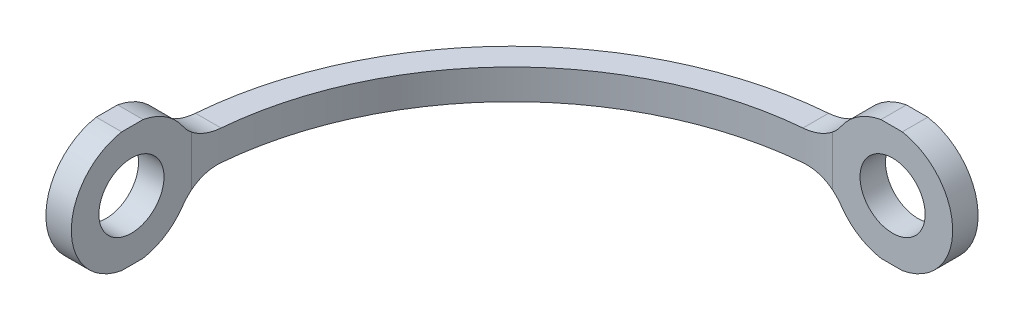
ISO-10303-21;
HEADER;
FILE_DESCRIPTION(('STEP AP214'),'2;1');
FILE_NAME('part.step','',(''),(''),'','','');
FILE_SCHEMA(('AUTOMOTIVE_DESIGN { 1 0 10303 214 1 1 1 1 }'));
ENDSEC;
DATA;
#1=APPLICATION_CONTEXT('core data for automotive mechanical design processes');
#2=APPLICATION_PROTOCOL_DEFINITION('international standard','automotive_design',2000,#1);
#3=PRODUCT_CONTEXT('',#1,'mechanical');
#4=PRODUCT('Part','Part','',(#3));
#5=PRODUCT_RELATED_PRODUCT_CATEGORY('part','',(#4));
#6=PRODUCT_DEFINITION_FORMATION('','',#4);
#7=PRODUCT_DEFINITION_CONTEXT('part definition',#1,'design');
#8=PRODUCT_DEFINITION('design','',#6,#7);
#9=PRODUCT_DEFINITION_SHAPE('','',#8);
#10=(LENGTH_UNIT() NAMED_UNIT(*) SI_UNIT(.MILLI.,.METRE.));
#11=(NAMED_UNIT(*) PLANE_ANGLE_UNIT() SI_UNIT($,.RADIAN.));
#12=(NAMED_UNIT(*) SI_UNIT($,.STERADIAN.) SOLID_ANGLE_UNIT());
#13=UNCERTAINTY_MEASURE_WITH_UNIT(LENGTH_MEASURE(1.E-05),#10,'distance_accuracy_value','');
#14=(GEOMETRIC_REPRESENTATION_CONTEXT(3) GLOBAL_UNCERTAINTY_ASSIGNED_CONTEXT((#13)) GLOBAL_UNIT_ASSIGNED_CONTEXT((#10,
#11,#12)) REPRESENTATION_CONTEXT('',''));
#15=CARTESIAN_POINT('',(0.,0.,0.));
#16=DIRECTION('',(0.,0.,1.));
#17=DIRECTION('',(1.,0.,0.));
#18=AXIS2_PLACEMENT_3D('',#15,#16,#17);
#19=CARTESIAN_POINT('',(-23.75,3.75,0.));
#20=DIRECTION('',(1.,0.,0.));
#21=DIRECTION('',(0.,0.,-1.));
#22=AXIS2_PLACEMENT_3D('',#19,#20,#21);
#23=PLANE('',#22);
#24=CARTESIAN_POINT('',(-23.75,0.,0.));
#25=DIRECTION('',(1.,0.,0.));
#26=DIRECTION('',(0.,0.,-1.));
#27=AXIS2_PLACEMENT_3D('',#24,#25,#26);
#28=CIRCLE('',#27,2.032);
#29=CARTESIAN_POINT('',(-23.75,0.,-2.032));
#30=VERTEX_POINT('',#29);
#31=EDGE_CURVE('E515',#30,#30,#28,.T.);
#32=ORIENTED_EDGE('',*,*,#31,.F.);
#33=EDGE_LOOP('',(#32));
#34=FACE_BOUND('',#33,.T.);
#35=DIRECTION('',(0.,0.,1.));
#36=VECTOR('',#35,1.);
#37=CARTESIAN_POINT('',(-23.75,3.75,0.));
#38=LINE('',#37,#36);
#39=CARTESIAN_POINT('',(-23.75,3.75,-0.724090821773479));
#40=VERTEX_POINT('',#39);
#41=CARTESIAN_POINT('',(-23.75,3.75,0.60690332177348));
#42=VERTEX_POINT('',#41);
#43=EDGE_CURVE('E320',#40,#42,#38,.T.);
#44=ORIENTED_EDGE('',*,*,#43,.T.);
#45=CARTESIAN_POINT('',(-23.75,0.,-0.0585937499999996));
#46=DIRECTION('',(1.,0.,0.));
#47=DIRECTION('',(0.,0.,-1.));
#48=AXIS2_PLACEMENT_3D('',#45,#46,#47);
#49=CIRCLE('',#48,3.80859375);
#50=CARTESIAN_POINT('',(-23.75,-3.75,0.60690332177348));
#51=VERTEX_POINT('',#50);
#52=EDGE_CURVE('E304',#42,#51,#49,.T.);
#53=ORIENTED_EDGE('',*,*,#52,.T.);
#54=DIRECTION('',(0.,0.,1.));
#55=VECTOR('',#54,1.);
#56=CARTESIAN_POINT('',(-23.75,-3.75,0.));
#57=LINE('',#56,#55);
#58=CARTESIAN_POINT('',(-23.75,-3.75,-0.724090821773479));
#59=VERTEX_POINT('',#58);
#60=EDGE_CURVE('E328',#59,#51,#57,.T.);
#61=ORIENTED_EDGE('',*,*,#60,.F.);
#62=CARTESIAN_POINT('',(-23.75,0.,-0.0585937499999996));
#63=DIRECTION('',(1.,0.,0.));
#64=DIRECTION('',(0.,0.,-1.));
#65=AXIS2_PLACEMENT_3D('',#62,#63,#64);
#66=CIRCLE('',#65,3.80859375);
#67=CARTESIAN_POINT('',(-23.75,-2.1570796460177,-3.1974460487352));
#68=VERTEX_POINT('',#67);
#69=EDGE_CURVE('E313',#59,#68,#66,.T.);
#70=ORIENTED_EDGE('',*,*,#69,.T.);
#71=CARTESIAN_POINT('',(-23.75,-3.75,-5.51536774626273));
#72=DIRECTION('',(1.,0.,0.));
#73=DIRECTION('',(0.,0.,-1.));
#74=AXIS2_PLACEMENT_3D('',#71,#72,#73);
#75=CIRCLE('',#74,2.8125);
#76=CARTESIAN_POINT('',(-23.75,-1.56056332120433,-3.75));
#77=VERTEX_POINT('',#76);
#78=EDGE_CURVE('E421',#68,#77,#75,.F.);
#79=ORIENTED_EDGE('',*,*,#78,.T.);
#80=DIRECTION('',(0.,-1.,0.));
#81=VECTOR('',#80,1.);
#82=CARTESIAN_POINT('',(-23.75,0.9375,-3.75));
#83=LINE('',#82,#81);
#84=CARTESIAN_POINT('',(-23.75,1.56056332120433,-3.75));
#85=VERTEX_POINT('',#84);
#86=EDGE_CURVE('E178',#85,#77,#83,.T.);
#87=ORIENTED_EDGE('',*,*,#86,.F.);
#88=CARTESIAN_POINT('',(-23.75,3.75,-5.51536774626273));
#89=DIRECTION('',(1.,0.,0.));
#90=DIRECTION('',(0.,0.,-1.));
#91=AXIS2_PLACEMENT_3D('',#88,#89,#90);
#92=CIRCLE('',#91,2.8125);
#93=CARTESIAN_POINT('',(-23.75,2.1570796460177,-3.1974460487352));
#94=VERTEX_POINT('',#93);
#95=EDGE_CURVE('E463',#85,#94,#92,.F.);
#96=ORIENTED_EDGE('',*,*,#95,.T.);
#97=CARTESIAN_POINT('',(-23.75,0.,-0.0585937499999996));
#98=DIRECTION('',(1.,0.,0.));
#99=DIRECTION('',(0.,0.,-1.));
#100=AXIS2_PLACEMENT_3D('',#97,#98,#99);
#101=CIRCLE('',#100,3.80859375);
#102=EDGE_CURVE('E525',#94,#40,#101,.T.);
#103=ORIENTED_EDGE('',*,*,#102,.T.);
#104=EDGE_LOOP('',(#44,#53,#61,#70,#79,#87,#96,#103));
#105=FACE_BOUND('',#104,.T.);
#106=ADVANCED_FACE('F150',(#34,#105),#23,.T.);
#107=CARTESIAN_POINT('',(-25.3375,3.75,0.));
#108=DIRECTION('',(1.,0.,0.));
#109=DIRECTION('',(0.,0.,-1.));
#110=AXIS2_PLACEMENT_3D('',#107,#108,#109);
#111=PLANE('',#110);
#112=CARTESIAN_POINT('',(-25.3375,0.,0.));
#113=DIRECTION('',(1.,0.,0.));
#114=DIRECTION('',(0.,0.,-1.));
#115=AXIS2_PLACEMENT_3D('',#112,#113,#114);
#116=CIRCLE('',#115,2.032);
#117=CARTESIAN_POINT('',(-25.3375,0.,-2.032));
#118=VERTEX_POINT('',#117);
#119=EDGE_CURVE('E511',#118,#118,#116,.T.);
#120=ORIENTED_EDGE('',*,*,#119,.T.);
#121=EDGE_LOOP('',(#120));
#122=FACE_BOUND('',#121,.T.);
#123=CARTESIAN_POINT('',(-25.3375,0.,-0.0585937499999996));
#124=DIRECTION('',(1.,0.,0.));
#125=DIRECTION('',(0.,0.,-1.));
#126=AXIS2_PLACEMENT_3D('',#123,#124,#125);
#127=CIRCLE('',#126,3.80859375);
#128=CARTESIAN_POINT('',(-25.3375,3.75,0.60690332177348));
#129=VERTEX_POINT('',#128);
#130=CARTESIAN_POINT('',(-25.3375,-3.75,0.60690332177348));
#131=VERTEX_POINT('',#130);
#132=EDGE_CURVE('E292',#129,#131,#127,.T.);
#133=ORIENTED_EDGE('',*,*,#132,.F.);
#134=DIRECTION('',(0.,0.,1.));
#135=VECTOR('',#134,1.);
#136=CARTESIAN_POINT('',(-25.3375,3.75,0.));
#137=LINE('',#136,#135);
#138=CARTESIAN_POINT('',(-25.3375,3.75,-0.724090821773479));
#139=VERTEX_POINT('',#138);
#140=EDGE_CURVE('E297',#139,#129,#137,.T.);
#141=ORIENTED_EDGE('',*,*,#140,.F.);
#142=CARTESIAN_POINT('',(-25.3375,0.,-0.0585937499999996));
#143=DIRECTION('',(1.,0.,0.));
#144=DIRECTION('',(0.,0.,-1.));
#145=AXIS2_PLACEMENT_3D('',#142,#143,#144);
#146=CIRCLE('',#145,3.80859375);
#147=CARTESIAN_POINT('',(-25.3375,2.1570796460177,-3.1974460487352));
#148=VERTEX_POINT('',#147);
#149=EDGE_CURVE('E460',#148,#139,#146,.T.);
#150=ORIENTED_EDGE('',*,*,#149,.F.);
#151=CARTESIAN_POINT('',(-25.3375,3.75,-5.51536774626273));
#152=DIRECTION('',(1.,0.,0.));
#153=DIRECTION('',(0.,0.,-1.));
#154=AXIS2_PLACEMENT_3D('',#151,#152,#153);
#155=CIRCLE('',#154,2.8125);
#156=CARTESIAN_POINT('',(-25.3375,1.56056332120433,-3.75));
#157=VERTEX_POINT('',#156);
#158=EDGE_CURVE('E164',#148,#157,#155,.T.);
#159=ORIENTED_EDGE('',*,*,#158,.T.);
#160=DIRECTION('',(0.,-1.,0.));
#161=VECTOR('',#160,1.);
#162=CARTESIAN_POINT('',(-25.3375,0.9375,-3.75));
#163=LINE('',#162,#161);
#164=CARTESIAN_POINT('',(-25.3375,-1.56056332120433,-3.75));
#165=VERTEX_POINT('',#164);
#166=EDGE_CURVE('E170',#157,#165,#163,.T.);
#167=ORIENTED_EDGE('',*,*,#166,.T.);
#168=CARTESIAN_POINT('',(-25.3375,-3.75,-5.51536774626273));
#169=DIRECTION('',(1.,0.,0.));
#170=DIRECTION('',(0.,0.,-1.));
#171=AXIS2_PLACEMENT_3D('',#168,#169,#170);
#172=CIRCLE('',#171,2.8125);
#173=CARTESIAN_POINT('',(-25.3375,-2.1570796460177,-3.1974460487352));
#174=VERTEX_POINT('',#173);
#175=EDGE_CURVE('E396',#165,#174,#172,.T.);
#176=ORIENTED_EDGE('',*,*,#175,.T.);
#177=CARTESIAN_POINT('',(-25.3375,0.,-0.0585937499999996));
#178=DIRECTION('',(1.,0.,0.));
#179=DIRECTION('',(0.,0.,-1.));
#180=AXIS2_PLACEMENT_3D('',#177,#178,#179);
#181=CIRCLE('',#180,3.80859375);
#182=CARTESIAN_POINT('',(-25.3375,-3.75,-0.724090821773479));
#183=VERTEX_POINT('',#182);
#184=EDGE_CURVE('E526',#183,#174,#181,.T.);
#185=ORIENTED_EDGE('',*,*,#184,.F.);
#186=DIRECTION('',(0.,0.,1.));
#187=VECTOR('',#186,1.);
#188=CARTESIAN_POINT('',(-25.3375,-3.75,0.));
#189=LINE('',#188,#187);
#190=EDGE_CURVE('E300',#183,#131,#189,.T.);
#191=ORIENTED_EDGE('',*,*,#190,.T.);
#192=EDGE_LOOP('',(#133,#141,#150,#159,#167,#176,#185,#191));
#193=FACE_BOUND('',#192,.T.);
#194=ADVANCED_FACE('F294',(#122,#193),#111,.F.);
#195=CARTESIAN_POINT('',(0.,3.75,0.));
#196=DIRECTION('',(0.,1.,0.));
#197=DIRECTION('',(0.,0.,1.));
#198=AXIS2_PLACEMENT_3D('',#195,#196,#197);
#199=PLANE('',#198);
#200=ORIENTED_EDGE('',*,*,#140,.T.);
#201=DIRECTION('',(1.,0.,0.));
#202=VECTOR('',#201,1.);
#203=CARTESIAN_POINT('',(-25.3375,3.75,0.60690332177348));
#204=LINE('',#203,#202);
#205=EDGE_CURVE('E307',#129,#42,#204,.T.);
#206=ORIENTED_EDGE('',*,*,#205,.T.);
#207=ORIENTED_EDGE('',*,*,#43,.F.);
#208=DIRECTION('',(1.,0.,0.));
#209=VECTOR('',#208,1.);
#210=CARTESIAN_POINT('',(-25.3375,3.75,-0.724090821773479));
#211=LINE('',#210,#209);
#212=EDGE_CURVE('E318',#139,#40,#211,.T.);
#213=ORIENTED_EDGE('',*,*,#212,.F.);
#214=EDGE_LOOP('',(#200,#206,#207,#213));
#215=FACE_BOUND('',#214,.T.);
#216=ADVANCED_FACE('F316',(#215),#199,.T.);
#217=CARTESIAN_POINT('',(0.,-3.75,0.));
#218=DIRECTION('',(0.,1.,0.));
#219=DIRECTION('',(0.,0.,1.));
#220=AXIS2_PLACEMENT_3D('',#217,#218,#219);
#221=PLANE('',#220);
#222=DIRECTION('',(1.,0.,0.));
#223=VECTOR('',#222,1.);
#224=CARTESIAN_POINT('',(-25.3375,-3.75,-0.724090821773479));
#225=LINE('',#224,#223);
#226=EDGE_CURVE('E522',#183,#59,#225,.T.);
#227=ORIENTED_EDGE('',*,*,#226,.T.);
#228=ORIENTED_EDGE('',*,*,#60,.T.);
#229=DIRECTION('',(1.,0.,0.));
#230=VECTOR('',#229,1.);
#231=CARTESIAN_POINT('',(-25.3375,-3.75,0.60690332177348));
#232=LINE('',#231,#230);
#233=EDGE_CURVE('E303',#131,#51,#232,.T.);
#234=ORIENTED_EDGE('',*,*,#233,.F.);
#235=ORIENTED_EDGE('',*,*,#190,.F.);
#236=EDGE_LOOP('',(#227,#228,#234,#235));
#237=FACE_BOUND('',#236,.T.);
#238=ADVANCED_FACE('F591',(#237),#221,.F.);
#239=CARTESIAN_POINT('',(0.,3.75,-23.75));
#240=DIRECTION('',(0.,0.,-1.));
#241=DIRECTION('',(-1.,0.,0.));
#242=AXIS2_PLACEMENT_3D('',#239,#240,#241);
#243=PLANE('',#242);
#244=CARTESIAN_POINT('',(0.,0.,-23.75));
#245=DIRECTION('',(0.,0.,1.));
#246=DIRECTION('',(1.,0.,0.));
#247=AXIS2_PLACEMENT_3D('',#244,#245,#246);
#248=CIRCLE('',#247,2.032);
#249=CARTESIAN_POINT('',(2.032,0.,-23.75));
#250=VERTEX_POINT('',#249);
#251=EDGE_CURVE('E483',#250,#250,#248,.T.);
#252=ORIENTED_EDGE('',*,*,#251,.F.);
#253=EDGE_LOOP('',(#252));
#254=FACE_BOUND('',#253,.T.);
#255=DIRECTION('',(1.,0.,0.));
#256=VECTOR('',#255,1.);
#257=CARTESIAN_POINT('',(0.,-3.75,-23.75));
#258=LINE('',#257,#256);
#259=CARTESIAN_POINT('',(-0.724090821773469,-3.75,-23.75));
#260=VERTEX_POINT('',#259);
#261=CARTESIAN_POINT('',(0.606903321773469,-3.75,-23.75));
#262=VERTEX_POINT('',#261);
#263=EDGE_CURVE('E477',#260,#262,#258,.T.);
#264=ORIENTED_EDGE('',*,*,#263,.T.);
#265=CARTESIAN_POINT('',(-0.0585937500000001,0.,-23.75));
#266=DIRECTION('',(0.,0.,1.));
#267=DIRECTION('',(1.,0.,0.));
#268=AXIS2_PLACEMENT_3D('',#265,#266,#267);
#269=CIRCLE('',#268,3.80859375);
#270=CARTESIAN_POINT('',(0.606903321773469,3.75,-23.75));
#271=VERTEX_POINT('',#270);
#272=EDGE_CURVE('E493',#262,#271,#269,.T.);
#273=ORIENTED_EDGE('',*,*,#272,.T.);
#274=DIRECTION('',(1.,0.,0.));
#275=VECTOR('',#274,1.);
#276=CARTESIAN_POINT('',(0.,3.75,-23.75));
#277=LINE('',#276,#275);
#278=CARTESIAN_POINT('',(-0.724090821773469,3.75,-23.75));
#279=VERTEX_POINT('',#278);
#280=EDGE_CURVE('E447',#279,#271,#277,.T.);
#281=ORIENTED_EDGE('',*,*,#280,.F.);
#282=CARTESIAN_POINT('',(-0.0585937500000001,0.,-23.75));
#283=DIRECTION('',(0.,0.,1.));
#284=DIRECTION('',(1.,0.,0.));
#285=AXIS2_PLACEMENT_3D('',#282,#283,#284);
#286=CIRCLE('',#285,3.80859375);
#287=CARTESIAN_POINT('',(-3.1974460487352,2.1570796460177,-23.75));
#288=VERTEX_POINT('',#287);
#289=EDGE_CURVE('E491',#279,#288,#286,.T.);
#290=ORIENTED_EDGE('',*,*,#289,.T.);
#291=CARTESIAN_POINT('',(-5.51536774626272,3.75,-23.75));
#292=DIRECTION('',(0.,0.,-1.));
#293=DIRECTION('',(-1.,0.,0.));
#294=AXIS2_PLACEMENT_3D('',#291,#292,#293);
#295=CIRCLE('',#294,2.8125);
#296=CARTESIAN_POINT('',(-3.75,1.56056332120433,-23.75));
#297=VERTEX_POINT('',#296);
#298=EDGE_CURVE('E422',#288,#297,#295,.T.);
#299=ORIENTED_EDGE('',*,*,#298,.T.);
#300=DIRECTION('',(0.,-1.,0.));
#301=VECTOR('',#300,1.);
#302=CARTESIAN_POINT('',(-3.75,0.9375,-23.75));
#303=LINE('',#302,#301);
#304=CARTESIAN_POINT('',(-3.75,-1.56056332120433,-23.75));
#305=VERTEX_POINT('',#304);
#306=EDGE_CURVE('E455',#297,#305,#303,.T.);
#307=ORIENTED_EDGE('',*,*,#306,.T.);
#308=CARTESIAN_POINT('',(-5.51536774626272,-3.75,-23.75));
#309=DIRECTION('',(0.,0.,-1.));
#310=DIRECTION('',(-1.,0.,0.));
#311=AXIS2_PLACEMENT_3D('',#308,#309,#310);
#312=CIRCLE('',#311,2.8125);
#313=CARTESIAN_POINT('',(-3.1974460487352,-2.1570796460177,-23.75));
#314=VERTEX_POINT('',#313);
#315=EDGE_CURVE('E546',#305,#314,#312,.T.);
#316=ORIENTED_EDGE('',*,*,#315,.T.);
#317=CARTESIAN_POINT('',(-0.0585937500000001,0.,-23.75));
#318=DIRECTION('',(0.,0.,1.));
#319=DIRECTION('',(1.,0.,0.));
#320=AXIS2_PLACEMENT_3D('',#317,#318,#319);
#321=CIRCLE('',#320,3.80859375);
#322=EDGE_CURVE('E509',#314,#260,#321,.T.);
#323=ORIENTED_EDGE('',*,*,#322,.T.);
#324=EDGE_LOOP('',(#264,#273,#281,#290,#299,#307,#316,#323));
#325=FACE_BOUND('',#324,.T.);
#326=ADVANCED_FACE('F564',(#254,#325),#243,.F.);
#327=CARTESIAN_POINT('',(0.,3.75,-25.3375));
#328=DIRECTION('',(0.,0.,-1.));
#329=DIRECTION('',(-1.,0.,0.));
#330=AXIS2_PLACEMENT_3D('',#327,#328,#329);
#331=PLANE('',#330);
#332=CARTESIAN_POINT('',(0.,0.,-25.3375));
#333=DIRECTION('',(0.,0.,1.));
#334=DIRECTION('',(1.,0.,0.));
#335=AXIS2_PLACEMENT_3D('',#332,#333,#334);
#336=CIRCLE('',#335,2.032);
#337=CARTESIAN_POINT('',(2.032,0.,-25.3375));
#338=VERTEX_POINT('',#337);
#339=EDGE_CURVE('E479',#338,#338,#336,.T.);
#340=ORIENTED_EDGE('',*,*,#339,.T.);
#341=EDGE_LOOP('',(#340));
#342=FACE_BOUND('',#341,.T.);
#343=CARTESIAN_POINT('',(-0.0585937500000001,0.,-25.3375));
#344=DIRECTION('',(0.,0.,1.));
#345=DIRECTION('',(1.,0.,0.));
#346=AXIS2_PLACEMENT_3D('',#343,#344,#345);
#347=CIRCLE('',#346,3.80859375);
#348=CARTESIAN_POINT('',(0.606903321773469,-3.75,-25.3375));
#349=VERTEX_POINT('',#348);
#350=CARTESIAN_POINT('',(0.606903321773469,3.75,-25.3375));
#351=VERTEX_POINT('',#350);
#352=EDGE_CURVE('E492',#349,#351,#347,.T.);
#353=ORIENTED_EDGE('',*,*,#352,.F.);
#354=DIRECTION('',(1.,0.,0.));
#355=VECTOR('',#354,1.);
#356=CARTESIAN_POINT('',(0.,-3.75,-25.3375));
#357=LINE('',#356,#355);
#358=CARTESIAN_POINT('',(-0.724090821773469,-3.75,-25.3375));
#359=VERTEX_POINT('',#358);
#360=EDGE_CURVE('E474',#359,#349,#357,.T.);
#361=ORIENTED_EDGE('',*,*,#360,.F.);
#362=CARTESIAN_POINT('',(-0.0585937500000001,0.,-25.3375));
#363=DIRECTION('',(0.,0.,1.));
#364=DIRECTION('',(1.,0.,0.));
#365=AXIS2_PLACEMENT_3D('',#362,#363,#364);
#366=CIRCLE('',#365,3.80859375);
#367=CARTESIAN_POINT('',(-3.1974460487352,-2.1570796460177,-25.3375));
#368=VERTEX_POINT('',#367);
#369=EDGE_CURVE('E508',#368,#359,#366,.T.);
#370=ORIENTED_EDGE('',*,*,#369,.F.);
#371=CARTESIAN_POINT('',(-5.51536774626272,-3.75,-25.3375));
#372=DIRECTION('',(0.,0.,-1.));
#373=DIRECTION('',(-1.,0.,0.));
#374=AXIS2_PLACEMENT_3D('',#371,#372,#373);
#375=CIRCLE('',#374,2.8125);
#376=CARTESIAN_POINT('',(-3.75,-1.56056332120433,-25.3375));
#377=VERTEX_POINT('',#376);
#378=EDGE_CURVE('E348',#368,#377,#375,.F.);
#379=ORIENTED_EDGE('',*,*,#378,.T.);
#380=DIRECTION('',(0.,-1.,0.));
#381=VECTOR('',#380,1.);
#382=CARTESIAN_POINT('',(-3.75,0.9375,-25.3375));
#383=LINE('',#382,#381);
#384=CARTESIAN_POINT('',(-3.75,1.56056332120433,-25.3375));
#385=VERTEX_POINT('',#384);
#386=EDGE_CURVE('E453',#385,#377,#383,.T.);
#387=ORIENTED_EDGE('',*,*,#386,.F.);
#388=CARTESIAN_POINT('',(-5.51536774626272,3.75,-25.3375));
#389=DIRECTION('',(0.,0.,-1.));
#390=DIRECTION('',(-1.,0.,0.));
#391=AXIS2_PLACEMENT_3D('',#388,#389,#390);
#392=CIRCLE('',#391,2.8125);
#393=CARTESIAN_POINT('',(-3.1974460487352,2.1570796460177,-25.3375));
#394=VERTEX_POINT('',#393);
#395=EDGE_CURVE('E545',#385,#394,#392,.F.);
#396=ORIENTED_EDGE('',*,*,#395,.T.);
#397=CARTESIAN_POINT('',(-0.0585937500000001,0.,-25.3375));
#398=DIRECTION('',(0.,0.,1.));
#399=DIRECTION('',(1.,0.,0.));
#400=AXIS2_PLACEMENT_3D('',#397,#398,#399);
#401=CIRCLE('',#400,3.80859375);
#402=CARTESIAN_POINT('',(-0.724090821773469,3.75,-25.3375));
#403=VERTEX_POINT('',#402);
#404=EDGE_CURVE('E500',#403,#394,#401,.T.);
#405=ORIENTED_EDGE('',*,*,#404,.F.);
#406=DIRECTION('',(1.,0.,0.));
#407=VECTOR('',#406,1.);
#408=CARTESIAN_POINT('',(0.,3.75,-25.3375));
#409=LINE('',#408,#407);
#410=EDGE_CURVE('E444',#403,#351,#409,.T.);
#411=ORIENTED_EDGE('',*,*,#410,.T.);
#412=EDGE_LOOP('',(#353,#361,#370,#379,#387,#396,#405,#411));
#413=FACE_BOUND('',#412,.T.);
#414=ADVANCED_FACE('F559',(#342,#413),#331,.T.);
#415=CARTESIAN_POINT('',(0.,-3.75,0.));
#416=DIRECTION('',(0.,1.,0.));
#417=DIRECTION('',(0.,0.,1.));
#418=AXIS2_PLACEMENT_3D('',#415,#416,#417);
#419=PLANE('',#418);
#420=DIRECTION('',(0.,0.,1.));
#421=VECTOR('',#420,1.);
#422=CARTESIAN_POINT('',(0.606903321773469,-3.75,-25.3375));
#423=LINE('',#422,#421);
#424=EDGE_CURVE('E496',#349,#262,#423,.T.);
#425=ORIENTED_EDGE('',*,*,#424,.T.);
#426=ORIENTED_EDGE('',*,*,#263,.F.);
#427=DIRECTION('',(0.,0.,1.));
#428=VECTOR('',#427,1.);
#429=CARTESIAN_POINT('',(-0.724090821773469,-3.75,-25.3375));
#430=LINE('',#429,#428);
#431=EDGE_CURVE('E505',#359,#260,#430,.T.);
#432=ORIENTED_EDGE('',*,*,#431,.F.);
#433=ORIENTED_EDGE('',*,*,#360,.T.);
#434=EDGE_LOOP('',(#425,#426,#432,#433));
#435=FACE_BOUND('',#434,.T.);
#436=ADVANCED_FACE('F562',(#435),#419,.F.);
#437=CARTESIAN_POINT('',(0.,3.75,0.));
#438=DIRECTION('',(0.,1.,0.));
#439=DIRECTION('',(0.,0.,1.));
#440=AXIS2_PLACEMENT_3D('',#437,#438,#439);
#441=PLANE('',#440);
#442=ORIENTED_EDGE('',*,*,#280,.T.);
#443=DIRECTION('',(0.,0.,1.));
#444=VECTOR('',#443,1.);
#445=CARTESIAN_POINT('',(0.606903321773469,3.75,-25.3375));
#446=LINE('',#445,#444);
#447=EDGE_CURVE('E489',#351,#271,#446,.T.);
#448=ORIENTED_EDGE('',*,*,#447,.F.);
#449=ORIENTED_EDGE('',*,*,#410,.F.);
#450=DIRECTION('',(0.,0.,1.));
#451=VECTOR('',#450,1.);
#452=CARTESIAN_POINT('',(-0.724090821773469,3.75,-25.3375));
#453=LINE('',#452,#451);
#454=EDGE_CURVE('E486',#403,#279,#453,.T.);
#455=ORIENTED_EDGE('',*,*,#454,.T.);
#456=EDGE_LOOP('',(#442,#448,#449,#455));
#457=FACE_BOUND('',#456,.T.);
#458=ADVANCED_FACE('F374',(#457),#441,.T.);
#459=CARTESIAN_POINT('',(-3.75,0.9375,-3.75));
#460=DIRECTION('',(0.,-1.,0.));
#461=DIRECTION('',(0.,0.,-1.));
#462=AXIS2_PLACEMENT_3D('',#459,#460,#461);
#463=CYLINDRICAL_SURFACE('',#462,21.5875);
#464=CARTESIAN_POINT('',(-3.75,-0.9375,-3.75));
#465=DIRECTION('',(0.,1.,0.));
#466=DIRECTION('',(0.,0.,1.));
#467=AXIS2_PLACEMENT_3D('',#464,#465,#466);
#468=CIRCLE('',#467,21.5875);
#469=CARTESIAN_POINT('',(-25.2651953969852,-0.9375,-5.51536774626273));
#470=VERTEX_POINT('',#469);
#471=CARTESIAN_POINT('',(-5.51536774626272,-0.9375,-25.2651953969852));
#472=VERTEX_POINT('',#471);
#473=EDGE_CURVE('E438',#470,#472,#468,.F.);
#474=ORIENTED_EDGE('',*,*,#473,.F.);
#475=CARTESIAN_POINT('',(-25.2651953969852,-0.9375,-5.51536774626273));
#476=CARTESIAN_POINT('',(-25.2717217558268,-0.937503472351098,-5.43585416186746));
#477=CARTESIAN_POINT('',(-25.2777984224328,-0.940875194685704,-5.35635321840536));
#478=CARTESIAN_POINT('',(-25.2890377681447,-0.954345081140914,-5.19786444495695));
#479=CARTESIAN_POINT('',(-25.2942005138159,-0.964442755121366,-5.11887657800472));
#480=CARTESIAN_POINT('',(-25.3080265186864,-1.00403495322714,-4.88792003439603));
#481=CARTESIAN_POINT('',(-25.3154036960389,-1.04284113593898,-4.73732281709651));
#482=CARTESIAN_POINT('',(-25.3240338308249,-1.1197968784784,-4.51610592071666));
#483=CARTESIAN_POINT('',(-25.3265192397188,-1.14904841664185,-4.44227963912289));
#484=CARTESIAN_POINT('',(-25.3306822000775,-1.21370645371072,-4.29731258505503));
#485=CARTESIAN_POINT('',(-25.3323596911958,-1.24911341211965,-4.22617201355272));
#486=CARTESIAN_POINT('',(-25.3350178619855,-1.32695633930889,-4.08508900310209));
#487=CARTESIAN_POINT('',(-25.3359765536418,-1.36956867861164,-4.01524363101035));
#488=CARTESIAN_POINT('',(-25.3372187116092,-1.4607114359778,-3.87951654386469));
#489=CARTESIAN_POINT('',(-25.3375021483239,-1.50924211334292,-3.81363500266812));
#490=CARTESIAN_POINT('',(-25.3375,-1.56056332120443,-3.75000000000003));
#491=B_SPLINE_CURVE_WITH_KNOTS('',3,(#475,#476,#477,#478,#479,#480,#481,#482,#483,#484,#485,
#486,#487,#488,#489,#490),.UNSPECIFIED.,.F.,.F.,(4,2,2,2,2,2,2,4),(0.,0.239171445250047,
0.4783254632703,0.942852073484854,1.18097702418579,1.4191197586068,1.66427939594,
1.90944977837878),.UNSPECIFIED.);
#492=EDGE_CURVE('E389',#470,#165,#491,.T.);
#493=ORIENTED_EDGE('',*,*,#492,.T.);
#494=ORIENTED_EDGE('',*,*,#166,.F.);
#495=CARTESIAN_POINT('',(-25.3375,1.56056332120433,-3.75));
#496=CARTESIAN_POINT('',(-25.3375000530267,1.51048959596684,-3.81210795158343));
#497=CARTESIAN_POINT('',(-25.3372313814973,1.46308661231712,-3.87630527268948));
#498=CARTESIAN_POINT('',(-25.3360539180094,1.37390615367223,-4.00848226516097));
#499=CARTESIAN_POINT('',(-25.3351451732863,1.33212826383519,-4.07646165708151));
#500=CARTESIAN_POINT('',(-25.3313785680316,1.21788520040795,-4.28147735094193));
#501=CARTESIAN_POINT('',(-25.3274909397047,1.15360267159282,-4.42322083282858));
#502=CARTESIAN_POINT('',(-25.3191204038627,1.07477345991571,-4.64378508658154));
#503=CARTESIAN_POINT('',(-25.3158509879836,1.05125585060983,-4.71960520082195));
#504=CARTESIAN_POINT('',(-25.3084093948218,1.01070541197751,-4.87295099530739));
#505=CARTESIAN_POINT('',(-25.304237150186,0.993673066728496,-4.95047680241322));
#506=CARTESIAN_POINT('',(-25.2948353759149,0.965825475443744,-5.1089327384317));
#507=CARTESIAN_POINT('',(-25.2895783173621,0.955208188358318,-5.18989587128707));
#508=CARTESIAN_POINT('',(-25.2781035160207,0.941040708703425,-5.35237408770167));
#509=CARTESIAN_POINT('',(-25.2718857315648,0.93749082274439,-5.43388919505369));
#510=CARTESIAN_POINT('',(-25.2651953969852,0.9375,-5.51536774626273));
#511=B_SPLINE_CURVE_WITH_KNOTS('',3,(#495,#496,#497,#498,#499,#500,#501,#502,#503,#504,#505,
#506,#507,#508,#509,#510),.UNSPECIFIED.,.F.,.F.,(4,2,2,2,2,2,2,4),(0.,0.239166297928719,
0.478314948045533,0.942830592711207,1.18096118673584,1.41910955198117,1.66427445995376,
1.9094500038701),.UNSPECIFIED.);
#512=CARTESIAN_POINT('',(-25.2651953969852,0.9375,-5.51536774626273));
#513=VERTEX_POINT('',#512);
#514=EDGE_CURVE('E12',#157,#513,#511,.T.);
#515=ORIENTED_EDGE('',*,*,#514,.T.);
#516=CARTESIAN_POINT('',(-3.75,0.9375,-3.75));
#517=DIRECTION('',(0.,1.,0.));
#518=DIRECTION('',(0.,0.,1.));
#519=AXIS2_PLACEMENT_3D('',#516,#517,#518);
#520=CIRCLE('',#519,21.5875);
#521=CARTESIAN_POINT('',(-5.51536774626272,0.9375,-25.2651953969852));
#522=VERTEX_POINT('',#521);
#523=EDGE_CURVE('E437',#513,#522,#520,.F.);
#524=ORIENTED_EDGE('',*,*,#523,.T.);
#525=CARTESIAN_POINT('',(-5.51536774626272,0.9375,-25.2651953969852));
#526=CARTESIAN_POINT('',(-5.43585416186746,0.937503472351098,-25.2717217558268));
#527=CARTESIAN_POINT('',(-5.35635321840535,0.940875194685704,-25.2777984224328));
#528=CARTESIAN_POINT('',(-5.19786444495695,0.954345081140914,-25.2890377681447));
#529=CARTESIAN_POINT('',(-5.11887657800472,0.964442755121366,-25.2942005138159));
#530=CARTESIAN_POINT('',(-4.88792003439603,1.00403495322714,-25.3080265186864));
#531=CARTESIAN_POINT('',(-4.73732281709651,1.04284113593898,-25.3154036960389));
#532=CARTESIAN_POINT('',(-4.51610592071666,1.1197968784784,-25.3240338308249));
#533=CARTESIAN_POINT('',(-4.44227963912289,1.14904841664185,-25.3265192397188));
#534=CARTESIAN_POINT('',(-4.29731258505503,1.21370645371072,-25.3306822000775));
#535=CARTESIAN_POINT('',(-4.22617201355272,1.24911341211964,-25.3323596911958));
#536=CARTESIAN_POINT('',(-4.08508900310209,1.32695633930889,-25.3350178619855));
#537=CARTESIAN_POINT('',(-4.01524363101035,1.36956867861164,-25.3359765536418));
#538=CARTESIAN_POINT('',(-3.87951654386469,1.4607114359778,-25.3372187116092));
#539=CARTESIAN_POINT('',(-3.81363500266812,1.50924211334292,-25.3375021483239));
#540=CARTESIAN_POINT('',(-3.75000000000003,1.56056332120443,-25.3375));
#541=B_SPLINE_CURVE_WITH_KNOTS('',3,(#525,#526,#527,#528,#529,#530,#531,#532,#533,#534,#535,
#536,#537,#538,#539,#540),.UNSPECIFIED.,.F.,.F.,(4,2,2,2,2,2,2,4),(0.,0.239171445250047,
0.4783254632703,0.942852073484854,1.18097702418578,1.4191197586068,1.66427939593999,
1.90944977837878),.UNSPECIFIED.);
#542=EDGE_CURVE('E382',#522,#385,#541,.T.);
#543=ORIENTED_EDGE('',*,*,#542,.T.);
#544=ORIENTED_EDGE('',*,*,#386,.T.);
#545=CARTESIAN_POINT('',(-3.75,-1.56056332120433,-25.3375));
#546=CARTESIAN_POINT('',(-3.81210795158344,-1.51048959596683,-25.3375000530267));
#547=CARTESIAN_POINT('',(-3.87630527268948,-1.46308661231712,-25.3372313814973));
#548=CARTESIAN_POINT('',(-4.00848226516097,-1.37390615367223,-25.3360539180094));
#549=CARTESIAN_POINT('',(-4.07646165708151,-1.33212826383519,-25.3351451732863));
#550=CARTESIAN_POINT('',(-4.28147735094193,-1.21788520040795,-25.3313785680316));
#551=CARTESIAN_POINT('',(-4.42322083282858,-1.15360267159282,-25.3274909397048));
#552=CARTESIAN_POINT('',(-4.64378508658154,-1.07477345991571,-25.3191204038627));
#553=CARTESIAN_POINT('',(-4.71960520082195,-1.05125585060983,-25.3158509879836));
#554=CARTESIAN_POINT('',(-4.87295099530739,-1.01070541197751,-25.3084093948218));
#555=CARTESIAN_POINT('',(-4.95047680241322,-0.993673066728495,-25.304237150186));
#556=CARTESIAN_POINT('',(-5.1089327384317,-0.965825475443744,-25.2948353759149));
#557=CARTESIAN_POINT('',(-5.18989587128707,-0.955208188358318,-25.2895783173621));
#558=CARTESIAN_POINT('',(-5.35237408770167,-0.941040708703425,-25.2781035160207));
#559=CARTESIAN_POINT('',(-5.43388919505369,-0.93749082274439,-25.2718857315648));
#560=CARTESIAN_POINT('',(-5.51536774626272,-0.9375,-25.2651953969853));
#561=B_SPLINE_CURVE_WITH_KNOTS('',3,(#545,#546,#547,#548,#549,#550,#551,#552,#553,#554,#555,
#556,#557,#558,#559,#560),.UNSPECIFIED.,.F.,.F.,(4,2,2,2,2,2,2,4),(0.,0.239166297928719,
0.478314948045533,0.942830592711208,1.18096118673583,1.41910955198117,1.66427445995375,
1.90945000387009),.UNSPECIFIED.);
#562=EDGE_CURVE('E351',#377,#472,#561,.T.);
#563=ORIENTED_EDGE('',*,*,#562,.T.);
#564=EDGE_LOOP('',(#474,#493,#494,#515,#524,#543,#544,#563));
#565=FACE_BOUND('',#564,.T.);
#566=ADVANCED_FACE('F369',(#565),#463,.T.);
#567=CARTESIAN_POINT('',(-3.75,0.9375,-3.75));
#568=DIRECTION('',(0.,-1.,0.));
#569=DIRECTION('',(0.,0.,-1.));
#570=AXIS2_PLACEMENT_3D('',#567,#568,#569);
#571=CYLINDRICAL_SURFACE('',#570,20.);
#572=ORIENTED_EDGE('',*,*,#86,.T.);
#573=CARTESIAN_POINT('',(-23.75,-1.56056332120433,-3.75));
#574=CARTESIAN_POINT('',(-23.7500000550506,-1.5105351555018,-3.81205139496944));
#575=CARTESIAN_POINT('',(-23.7497105876823,-1.46317285892612,-3.87618847296402));
#576=CARTESIAN_POINT('',(-23.7484420736083,-1.37406354744852,-4.00823796481477));
#577=CARTESIAN_POINT('',(-23.7474630764066,-1.33231612968843,-4.07615010732171));
#578=CARTESIAN_POINT('',(-23.7434055263507,-1.21814990955013,-4.28095303595863));
#579=CARTESIAN_POINT('',(-23.7392178414179,-1.15389841958181,-4.42254096781575));
#580=CARTESIAN_POINT('',(-23.7301951614627,-1.07502407433741,-4.64300834537817));
#581=CARTESIAN_POINT('',(-23.7266651356659,-1.05146108193932,-4.71890156554089));
#582=CARTESIAN_POINT('',(-23.7186285931799,-1.01083425238713,-4.872392032709));
#583=CARTESIAN_POINT('',(-23.7141219997647,-0.993770926183688,-4.94998941317462));
#584=CARTESIAN_POINT('',(-23.7039649247288,-0.965872779065191,-5.10859244720183));
#585=CARTESIAN_POINT('',(-23.6982845659596,-0.95523699616616,-5.18963104300955));
#586=CARTESIAN_POINT('',(-23.6858847141409,-0.941045807333723,-5.35225009218459));
#587=CARTESIAN_POINT('',(-23.679165181031,-0.937490674435495,-5.43383056632544));
#588=CARTESIAN_POINT('',(-23.6719345626989,-0.9375,-5.51536774626273));
#589=B_SPLINE_CURVE_WITH_KNOTS('',3,(#573,#574,#575,#576,#577,#578,#579,#580,#581,#582,#583,
#584,#585,#586,#587,#588),.UNSPECIFIED.,.F.,.F.,(4,2,2,2,2,2,2,4),(0.,0.238948857169317,
0.477880561000844,0.941958620328583,1.18037062193198,1.41880136167268,1.66428056128556,
1.9097692265774),.UNSPECIFIED.);
#590=CARTESIAN_POINT('',(-23.6719345626989,-0.9375,-5.51536774626273));
#591=VERTEX_POINT('',#590);
#592=EDGE_CURVE('E397',#77,#591,#589,.T.);
#593=ORIENTED_EDGE('',*,*,#592,.T.);
#594=CARTESIAN_POINT('',(-3.75,-0.9375,-3.75));
#595=DIRECTION('',(0.,1.,0.));
#596=DIRECTION('',(0.,0.,1.));
#597=AXIS2_PLACEMENT_3D('',#594,#595,#596);
#598=CIRCLE('',#597,20.);
#599=CARTESIAN_POINT('',(-5.51536774626272,-0.9375,-23.6719345626989));
#600=VERTEX_POINT('',#599);
#601=EDGE_CURVE('E429',#591,#600,#598,.F.);
#602=ORIENTED_EDGE('',*,*,#601,.T.);
#603=CARTESIAN_POINT('',(-5.51536774626272,-0.9375,-23.6719345626989));
#604=CARTESIAN_POINT('',(-5.43597049835846,-0.937503419818518,-23.6789725468404));
#605=CARTESIAN_POINT('',(-5.3565796390845,-0.940865345011198,-23.6855263243644));
#606=CARTESIAN_POINT('',(-5.19829809202715,-0.954298851061204,-23.6976496029504));
#607=CARTESIAN_POINT('',(-5.11940736928303,-0.964369957591652,-23.7032191735587));
#608=CARTESIAN_POINT('',(-4.88872280527577,-1.00386235875656,-23.7181366704075));
#609=CARTESIAN_POINT('',(-4.73828225428612,-1.04257490768783,-23.726099510588));
#610=CARTESIAN_POINT('',(-4.51710760192205,-1.11941395786691,-23.7354261595133));
#611=CARTESIAN_POINT('',(-4.44318929809586,-1.14867057664431,-23.7381159686281));
#612=CARTESIAN_POINT('',(-4.29803878949096,-1.21335503252704,-23.7426213036114));
#613=CARTESIAN_POINT('',(-4.22680679648819,-1.24878335494799,-23.7444367606825));
#614=CARTESIAN_POINT('',(-4.08553591264888,-1.32668913053201,-23.7473136838438));
#615=CARTESIAN_POINT('',(-4.01559455612568,-1.36934402110015,-23.7483512717767));
#616=CARTESIAN_POINT('',(-3.87968452921916,-1.46058765823546,-23.7496956111876));
#617=CARTESIAN_POINT('',(-3.81371601408227,-1.50917663646418,-23.7500023341237));
#618=CARTESIAN_POINT('',(-3.75000000000003,-1.56056332120443,-23.75));
#619=B_SPLINE_CURVE_WITH_KNOTS('',3,(#603,#604,#605,#606,#607,#608,#609,#610,#611,#612,#613,
#614,#615,#616,#617,#618),.UNSPECIFIED.,.F.,.F.,(4,2,2,2,2,2,2,4),(0.,0.238954810592149,
0.477892729307819,0.941983474083423,1.1803889407294,1.41881316300214,1.66428627081634,
1.90976896474936),.UNSPECIFIED.);
#620=EDGE_CURVE('E358',#600,#305,#619,.T.);
#621=ORIENTED_EDGE('',*,*,#620,.T.);
#622=ORIENTED_EDGE('',*,*,#306,.F.);
#623=CARTESIAN_POINT('',(-3.75,1.56056332120433,-23.75));
#624=CARTESIAN_POINT('',(-3.81205139496945,1.5105351555018,-23.7500000550506));
#625=CARTESIAN_POINT('',(-3.87618847296402,1.46317285892612,-23.7497105876823));
#626=CARTESIAN_POINT('',(-4.00823796481477,1.37406354744852,-23.7484420736083));
#627=CARTESIAN_POINT('',(-4.07615010732171,1.33231612968842,-23.7474630764066));
#628=CARTESIAN_POINT('',(-4.28095303595863,1.21814990955012,-23.7434055263507));
#629=CARTESIAN_POINT('',(-4.42254096781575,1.15389841958181,-23.7392178414179));
#630=CARTESIAN_POINT('',(-4.64300834537818,1.07502407433741,-23.7301951614627));
#631=CARTESIAN_POINT('',(-4.71890156554089,1.05146108193932,-23.7266651356659));
#632=CARTESIAN_POINT('',(-4.872392032709,1.01083425238713,-23.7186285931799));
#633=CARTESIAN_POINT('',(-4.94998941317462,0.993770926183688,-23.7141219997647));
#634=CARTESIAN_POINT('',(-5.10859244720183,0.965872779065191,-23.7039649247288));
#635=CARTESIAN_POINT('',(-5.18963104300955,0.95523699616616,-23.6982845659596));
#636=CARTESIAN_POINT('',(-5.35225009218458,0.941045807333723,-23.6858847141409));
#637=CARTESIAN_POINT('',(-5.43383056632544,0.937490674435495,-23.679165181031));
#638=CARTESIAN_POINT('',(-5.51536774626272,0.9375,-23.6719345626989));
#639=B_SPLINE_CURVE_WITH_KNOTS('',3,(#623,#624,#625,#626,#627,#628,#629,#630,#631,#632,#633,
#634,#635,#636,#637,#638),.UNSPECIFIED.,.F.,.F.,(4,2,2,2,2,2,2,4),(0.,0.238948857169317,
0.477880561000844,0.941958620328582,1.18037062193198,1.41880136167268,1.66428056128556,
1.90976922657739),.UNSPECIFIED.);
#640=CARTESIAN_POINT('',(-5.51536774626272,0.9375,-23.6719345626989));
#641=VERTEX_POINT('',#640);
#642=EDGE_CURVE('E415',#297,#641,#639,.T.);
#643=ORIENTED_EDGE('',*,*,#642,.T.);
#644=CARTESIAN_POINT('',(-3.75,0.9375,-3.75));
#645=DIRECTION('',(0.,1.,0.));
#646=DIRECTION('',(0.,0.,1.));
#647=AXIS2_PLACEMENT_3D('',#644,#645,#646);
#648=CIRCLE('',#647,20.);
#649=CARTESIAN_POINT('',(-23.6719345626989,0.9375,-5.51536774626273));
#650=VERTEX_POINT('',#649);
#651=EDGE_CURVE('E450',#650,#641,#648,.F.);
#652=ORIENTED_EDGE('',*,*,#651,.F.);
#653=CARTESIAN_POINT('',(-23.6719345626989,0.9375,-5.51536774626273));
#654=CARTESIAN_POINT('',(-23.6789725468404,0.937503419818518,-5.43597049835846));
#655=CARTESIAN_POINT('',(-23.6855263243644,0.940865345011198,-5.3565796390845));
#656=CARTESIAN_POINT('',(-23.6976496029504,0.954298851061204,-5.19829809202715));
#657=CARTESIAN_POINT('',(-23.7032191735587,0.964369957591651,-5.11940736928303));
#658=CARTESIAN_POINT('',(-23.7181366704075,1.00386235875656,-4.88872280527577));
#659=CARTESIAN_POINT('',(-23.726099510588,1.04257490768783,-4.73828225428612));
#660=CARTESIAN_POINT('',(-23.7354261595133,1.11941395786691,-4.51710760192205));
#661=CARTESIAN_POINT('',(-23.7381159686281,1.14867057664431,-4.44318929809586));
#662=CARTESIAN_POINT('',(-23.7426213036114,1.21335503252704,-4.29803878949096));
#663=CARTESIAN_POINT('',(-23.7444367606825,1.24878335494799,-4.22680679648819));
#664=CARTESIAN_POINT('',(-23.7473136838438,1.32668913053201,-4.08553591264887));
#665=CARTESIAN_POINT('',(-23.7483512717767,1.36934402110015,-4.01559455612568));
#666=CARTESIAN_POINT('',(-23.7496956111875,1.46058765823546,-3.87968452921916));
#667=CARTESIAN_POINT('',(-23.7500023341237,1.50917663646419,-3.81371601408227));
#668=CARTESIAN_POINT('',(-23.75,1.56056332120443,-3.75000000000003));
#669=B_SPLINE_CURVE_WITH_KNOTS('',3,(#653,#654,#655,#656,#657,#658,#659,#660,#661,#662,#663,
#664,#665,#666,#667,#668),.UNSPECIFIED.,.F.,.F.,(4,2,2,2,2,2,2,4),(0.,0.23895481059215,
0.477892729307822,0.941983474083424,1.1803889407294,1.41881316300214,1.66428627081634,
1.90976896474936),.UNSPECIFIED.);
#670=EDGE_CURVE('E535',#650,#85,#669,.T.);
#671=ORIENTED_EDGE('',*,*,#670,.T.);
#672=EDGE_LOOP('',(#572,#593,#602,#621,#622,#643,#652,#671));
#673=FACE_BOUND('',#672,.T.);
#674=ADVANCED_FACE('F373',(#673),#571,.F.);
#675=CARTESIAN_POINT('',(0.,0.9375,0.));
#676=DIRECTION('',(0.,1.,0.));
#677=DIRECTION('',(0.,0.,1.));
#678=AXIS2_PLACEMENT_3D('',#675,#676,#677);
#679=PLANE('',#678);
#680=ORIENTED_EDGE('',*,*,#651,.T.);
#681=DIRECTION('',(0.,0.,-1.));
#682=VECTOR('',#681,1.);
#683=CARTESIAN_POINT('',(-5.51536774626272,0.9375,-25.3375));
#684=LINE('',#683,#682);
#685=EDGE_CURVE('E338',#641,#522,#684,.T.);
#686=ORIENTED_EDGE('',*,*,#685,.T.);
#687=ORIENTED_EDGE('',*,*,#523,.F.);
#688=DIRECTION('',(-1.,0.,0.));
#689=VECTOR('',#688,1.);
#690=CARTESIAN_POINT('',(-23.75,0.9375,-5.51536774626273));
#691=LINE('',#690,#689);
#692=EDGE_CURVE('E335',#513,#650,#691,.F.);
#693=ORIENTED_EDGE('',*,*,#692,.T.);
#694=EDGE_LOOP('',(#680,#686,#687,#693));
#695=FACE_BOUND('',#694,.T.);
#696=ADVANCED_FACE('F470',(#695),#679,.T.);
#697=CARTESIAN_POINT('',(0.,-0.9375,0.));
#698=DIRECTION('',(0.,1.,0.));
#699=DIRECTION('',(0.,0.,1.));
#700=AXIS2_PLACEMENT_3D('',#697,#698,#699);
#701=PLANE('',#700);
#702=ORIENTED_EDGE('',*,*,#473,.T.);
#703=DIRECTION('',(0.,0.,1.));
#704=VECTOR('',#703,1.);
#705=CARTESIAN_POINT('',(-5.51536774626272,-0.9375,0.));
#706=LINE('',#705,#704);
#707=EDGE_CURVE('E333',#472,#600,#706,.T.);
#708=ORIENTED_EDGE('',*,*,#707,.T.);
#709=ORIENTED_EDGE('',*,*,#601,.F.);
#710=DIRECTION('',(1.,0.,0.));
#711=VECTOR('',#710,1.);
#712=CARTESIAN_POINT('',(0.,-0.9375,-5.51536774626273));
#713=LINE('',#712,#711);
#714=EDGE_CURVE('E323',#591,#470,#713,.F.);
#715=ORIENTED_EDGE('',*,*,#714,.T.);
#716=EDGE_LOOP('',(#702,#708,#709,#715));
#717=FACE_BOUND('',#716,.T.);
#718=ADVANCED_FACE('F434',(#717),#701,.F.);
#719=CARTESIAN_POINT('',(-0.0585937500000001,0.,-25.3375));
#720=DIRECTION('',(0.,0.,1.));
#721=DIRECTION('',(1.,0.,0.));
#722=AXIS2_PLACEMENT_3D('',#719,#720,#721);
#723=CYLINDRICAL_SURFACE('',#722,3.80859375);
#724=ORIENTED_EDGE('',*,*,#404,.T.);
#725=DIRECTION('',(0.,0.,1.));
#726=VECTOR('',#725,1.);
#727=CARTESIAN_POINT('',(-3.1974460487352,2.1570796460177,-25.3375));
#728=LINE('',#727,#726);
#729=EDGE_CURVE('E341',#394,#288,#728,.T.);
#730=ORIENTED_EDGE('',*,*,#729,.T.);
#731=ORIENTED_EDGE('',*,*,#289,.F.);
#732=ORIENTED_EDGE('',*,*,#454,.F.);
#733=EDGE_LOOP('',(#724,#730,#731,#732));
#734=FACE_BOUND('',#733,.T.);
#735=ADVANCED_FACE('F572',(#734),#723,.T.);
#736=CARTESIAN_POINT('',(-0.0585937500000001,0.,-25.3375));
#737=DIRECTION('',(0.,0.,1.));
#738=DIRECTION('',(1.,0.,0.));
#739=AXIS2_PLACEMENT_3D('',#736,#737,#738);
#740=CYLINDRICAL_SURFACE('',#739,3.80859375);
#741=ORIENTED_EDGE('',*,*,#272,.F.);
#742=ORIENTED_EDGE('',*,*,#424,.F.);
#743=ORIENTED_EDGE('',*,*,#352,.T.);
#744=ORIENTED_EDGE('',*,*,#447,.T.);
#745=EDGE_LOOP('',(#741,#742,#743,#744));
#746=FACE_BOUND('',#745,.T.);
#747=ADVANCED_FACE('F574',(#746),#740,.T.);
#748=CARTESIAN_POINT('',(0.,0.,-25.3375));
#749=DIRECTION('',(0.,0.,1.));
#750=DIRECTION('',(1.,0.,0.));
#751=AXIS2_PLACEMENT_3D('',#748,#749,#750);
#752=CYLINDRICAL_SURFACE('',#751,2.032);
#753=ORIENTED_EDGE('',*,*,#339,.F.);
#754=EDGE_LOOP('',(#753));
#755=FACE_BOUND('',#754,.T.);
#756=ORIENTED_EDGE('',*,*,#251,.T.);
#757=EDGE_LOOP('',(#756));
#758=FACE_BOUND('',#757,.T.);
#759=ADVANCED_FACE('F580',(#755,#758),#752,.F.);
#760=CARTESIAN_POINT('',(-0.0585937500000001,0.,-25.3375));
#761=DIRECTION('',(0.,0.,1.));
#762=DIRECTION('',(1.,0.,0.));
#763=AXIS2_PLACEMENT_3D('',#760,#761,#762);
#764=CYLINDRICAL_SURFACE('',#763,3.80859375);
#765=ORIENTED_EDGE('',*,*,#322,.F.);
#766=DIRECTION('',(0.,0.,1.));
#767=VECTOR('',#766,1.);
#768=CARTESIAN_POINT('',(-3.1974460487352,-2.1570796460177,-25.3375));
#769=LINE('',#768,#767);
#770=EDGE_CURVE('E319',#314,#368,#769,.F.);
#771=ORIENTED_EDGE('',*,*,#770,.T.);
#772=ORIENTED_EDGE('',*,*,#369,.T.);
#773=ORIENTED_EDGE('',*,*,#431,.T.);
#774=EDGE_LOOP('',(#765,#771,#772,#773));
#775=FACE_BOUND('',#774,.T.);
#776=ADVANCED_FACE('F555',(#775),#764,.T.);
#777=CARTESIAN_POINT('',(-25.3375,0.,-0.0585937499999996));
#778=DIRECTION('',(1.,0.,0.));
#779=DIRECTION('',(0.,0.,-1.));
#780=AXIS2_PLACEMENT_3D('',#777,#778,#779);
#781=CYLINDRICAL_SURFACE('',#780,3.80859375);
#782=ORIENTED_EDGE('',*,*,#184,.T.);
#783=DIRECTION('',(1.,0.,0.));
#784=VECTOR('',#783,1.);
#785=CARTESIAN_POINT('',(-25.3375,-2.1570796460177,-3.1974460487352));
#786=LINE('',#785,#784);
#787=EDGE_CURVE('E343',#174,#68,#786,.T.);
#788=ORIENTED_EDGE('',*,*,#787,.T.);
#789=ORIENTED_EDGE('',*,*,#69,.F.);
#790=ORIENTED_EDGE('',*,*,#226,.F.);
#791=EDGE_LOOP('',(#782,#788,#789,#790));
#792=FACE_BOUND('',#791,.T.);
#793=ADVANCED_FACE('F602',(#792),#781,.T.);
#794=CARTESIAN_POINT('',(-25.3375,0.,-0.0585937499999996));
#795=DIRECTION('',(1.,0.,0.));
#796=DIRECTION('',(0.,0.,-1.));
#797=AXIS2_PLACEMENT_3D('',#794,#795,#796);
#798=CYLINDRICAL_SURFACE('',#797,3.80859375);
#799=ORIENTED_EDGE('',*,*,#102,.F.);
#800=DIRECTION('',(1.,0.,0.));
#801=VECTOR('',#800,1.);
#802=CARTESIAN_POINT('',(-25.3375,2.1570796460177,-3.1974460487352));
#803=LINE('',#802,#801);
#804=EDGE_CURVE('E346',#94,#148,#803,.F.);
#805=ORIENTED_EDGE('',*,*,#804,.T.);
#806=ORIENTED_EDGE('',*,*,#149,.T.);
#807=ORIENTED_EDGE('',*,*,#212,.T.);
#808=EDGE_LOOP('',(#799,#805,#806,#807));
#809=FACE_BOUND('',#808,.T.);
#810=ADVANCED_FACE('F533',(#809),#798,.T.);
#811=CARTESIAN_POINT('',(-25.3375,0.,-0.0585937499999996));
#812=DIRECTION('',(1.,0.,0.));
#813=DIRECTION('',(0.,0.,-1.));
#814=AXIS2_PLACEMENT_3D('',#811,#812,#813);
#815=CYLINDRICAL_SURFACE('',#814,3.80859375);
#816=ORIENTED_EDGE('',*,*,#52,.F.);
#817=ORIENTED_EDGE('',*,*,#205,.F.);
#818=ORIENTED_EDGE('',*,*,#132,.T.);
#819=ORIENTED_EDGE('',*,*,#233,.T.);
#820=EDGE_LOOP('',(#816,#817,#818,#819));
#821=FACE_BOUND('',#820,.T.);
#822=ADVANCED_FACE('F308',(#821),#815,.T.);
#823=CARTESIAN_POINT('',(-25.3375,0.,0.));
#824=DIRECTION('',(1.,0.,0.));
#825=DIRECTION('',(0.,0.,-1.));
#826=AXIS2_PLACEMENT_3D('',#823,#824,#825);
#827=CYLINDRICAL_SURFACE('',#826,2.032);
#828=ORIENTED_EDGE('',*,*,#119,.F.);
#829=EDGE_LOOP('',(#828));
#830=FACE_BOUND('',#829,.T.);
#831=ORIENTED_EDGE('',*,*,#31,.T.);
#832=EDGE_LOOP('',(#831));
#833=FACE_BOUND('',#832,.T.);
#834=ADVANCED_FACE('F613',(#830,#833),#827,.F.);
#835=CARTESIAN_POINT('',(-5.51536774626272,-3.75,-25.3375));
#836=DIRECTION('',(0.,0.,1.));
#837=DIRECTION('',(1.,0.,0.));
#838=AXIS2_PLACEMENT_3D('',#835,#836,#837);
#839=CYLINDRICAL_SURFACE('',#838,2.8125);
#840=ORIENTED_EDGE('',*,*,#620,.F.);
#841=ORIENTED_EDGE('',*,*,#707,.F.);
#842=ORIENTED_EDGE('',*,*,#562,.F.);
#843=ORIENTED_EDGE('',*,*,#378,.F.);
#844=ORIENTED_EDGE('',*,*,#770,.F.);
#845=ORIENTED_EDGE('',*,*,#315,.F.);
#846=EDGE_LOOP('',(#840,#841,#842,#843,#844,#845));
#847=FACE_BOUND('',#846,.T.);
#848=ADVANCED_FACE('F365',(#847),#839,.F.);
#849=CARTESIAN_POINT('',(-5.51536774626272,3.75,-25.3375));
#850=DIRECTION('',(0.,0.,1.));
#851=DIRECTION('',(1.,0.,0.));
#852=AXIS2_PLACEMENT_3D('',#849,#850,#851);
#853=CYLINDRICAL_SURFACE('',#852,2.8125);
#854=ORIENTED_EDGE('',*,*,#298,.F.);
#855=ORIENTED_EDGE('',*,*,#729,.F.);
#856=ORIENTED_EDGE('',*,*,#395,.F.);
#857=ORIENTED_EDGE('',*,*,#542,.F.);
#858=ORIENTED_EDGE('',*,*,#685,.F.);
#859=ORIENTED_EDGE('',*,*,#642,.F.);
#860=EDGE_LOOP('',(#854,#855,#856,#857,#858,#859));
#861=FACE_BOUND('',#860,.T.);
#862=ADVANCED_FACE('F407',(#861),#853,.F.);
#863=CARTESIAN_POINT('',(-25.3375,-3.75,-5.51536774626273));
#864=DIRECTION('',(1.,0.,0.));
#865=DIRECTION('',(0.,0.,-1.));
#866=AXIS2_PLACEMENT_3D('',#863,#864,#865);
#867=CYLINDRICAL_SURFACE('',#866,2.8125);
#868=ORIENTED_EDGE('',*,*,#492,.F.);
#869=ORIENTED_EDGE('',*,*,#714,.F.);
#870=ORIENTED_EDGE('',*,*,#592,.F.);
#871=ORIENTED_EDGE('',*,*,#78,.F.);
#872=ORIENTED_EDGE('',*,*,#787,.F.);
#873=ORIENTED_EDGE('',*,*,#175,.F.);
#874=EDGE_LOOP('',(#868,#869,#870,#871,#872,#873));
#875=FACE_BOUND('',#874,.T.);
#876=ADVANCED_FACE('F404',(#875),#867,.F.);
#877=CARTESIAN_POINT('',(-25.3375,3.75,-5.51536774626273));
#878=DIRECTION('',(1.,0.,0.));
#879=DIRECTION('',(0.,0.,-1.));
#880=AXIS2_PLACEMENT_3D('',#877,#878,#879);
#881=CYLINDRICAL_SURFACE('',#880,2.8125);
#882=ORIENTED_EDGE('',*,*,#158,.F.);
#883=ORIENTED_EDGE('',*,*,#804,.F.);
#884=ORIENTED_EDGE('',*,*,#95,.F.);
#885=ORIENTED_EDGE('',*,*,#670,.F.);
#886=ORIENTED_EDGE('',*,*,#692,.F.);
#887=ORIENTED_EDGE('',*,*,#514,.F.);
#888=EDGE_LOOP('',(#882,#883,#884,#885,#886,#887));
#889=FACE_BOUND('',#888,.T.);
#890=ADVANCED_FACE('F152',(#889),#881,.F.);
#891=CLOSED_SHELL('',(#106,#194,#216,#238,#326,#414,#436,#458,#566,#674,#696,#718,#735,#747,
#759,#776,#793,#810,#822,#834,#848,#862,#876,#890));
#892=MANIFOLD_SOLID_BREP('B2',#891);
#893=ADVANCED_BREP_SHAPE_REPRESENTATION('',(#18,#892),#14);
#894=SHAPE_DEFINITION_REPRESENTATION(#9,#893);
ENDSEC;
END-ISO-10303-21;
